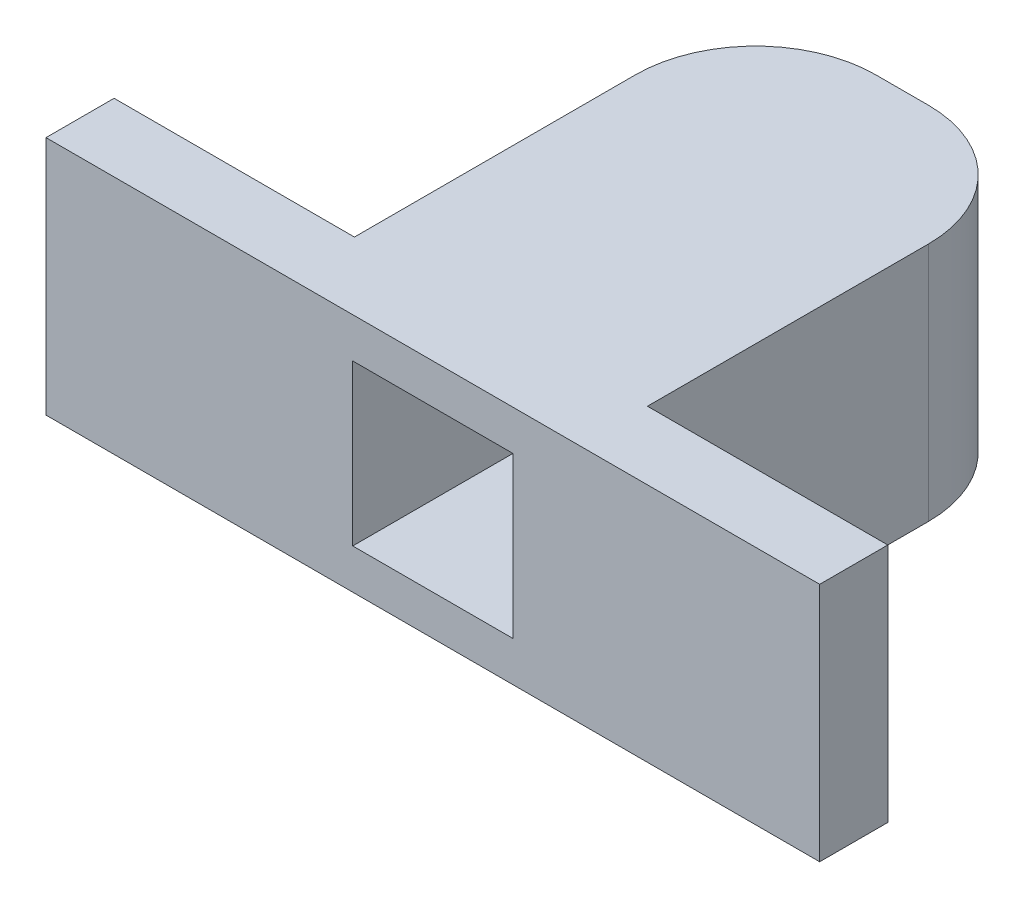
ISO-10303-21;
HEADER;
FILE_DESCRIPTION(('STEP AP214'),'2;1');
FILE_NAME('part.step','',(''),(''),'','','');
FILE_SCHEMA(('AUTOMOTIVE_DESIGN { 1 0 10303 214 1 1 1 1 }'));
ENDSEC;
DATA;
#1=APPLICATION_CONTEXT('core data for automotive mechanical design processes');
#2=APPLICATION_PROTOCOL_DEFINITION('international standard','automotive_design',2000,#1);
#3=PRODUCT_CONTEXT('',#1,'mechanical');
#4=PRODUCT('Part','Part','',(#3));
#5=PRODUCT_RELATED_PRODUCT_CATEGORY('part','',(#4));
#6=PRODUCT_DEFINITION_FORMATION('','',#4);
#7=PRODUCT_DEFINITION_CONTEXT('part definition',#1,'design');
#8=PRODUCT_DEFINITION('design','',#6,#7);
#9=PRODUCT_DEFINITION_SHAPE('','',#8);
#10=(LENGTH_UNIT() NAMED_UNIT(*) SI_UNIT(.MILLI.,.METRE.));
#11=(NAMED_UNIT(*) PLANE_ANGLE_UNIT() SI_UNIT($,.RADIAN.));
#12=(NAMED_UNIT(*) SI_UNIT($,.STERADIAN.) SOLID_ANGLE_UNIT());
#13=UNCERTAINTY_MEASURE_WITH_UNIT(LENGTH_MEASURE(1.E-05),#10,'distance_accuracy_value','');
#14=(GEOMETRIC_REPRESENTATION_CONTEXT(3) GLOBAL_UNCERTAINTY_ASSIGNED_CONTEXT((#13)) GLOBAL_UNIT_ASSIGNED_CONTEXT((#10,
#11,#12)) REPRESENTATION_CONTEXT('',''));
#15=CARTESIAN_POINT('',(0.,0.,0.));
#16=DIRECTION('',(0.,0.,1.));
#17=DIRECTION('',(1.,0.,0.));
#18=AXIS2_PLACEMENT_3D('',#15,#16,#17);
#19=CARTESIAN_POINT('',(13.8800748086397,3.,0.));
#20=DIRECTION('',(0.,0.,-1.));
#21=DIRECTION('',(-1.,0.,0.));
#22=AXIS2_PLACEMENT_3D('',#19,#20,#21);
#23=PLANE('',#22);
#24=DIRECTION('',(-1.,0.,0.));
#25=VECTOR('',#24,1.);
#26=CARTESIAN_POINT('',(8.05109057491405,2.5,0.));
#27=LINE('',#26,#25);
#28=CARTESIAN_POINT('',(10.051090574914,2.5,0.));
#29=VERTEX_POINT('',#28);
#30=CARTESIAN_POINT('',(8.05109057491405,2.5,0.));
#31=VERTEX_POINT('',#30);
#32=EDGE_CURVE('E241',#29,#31,#27,.T.);
#33=ORIENTED_EDGE('',*,*,#32,.F.);
#34=DIRECTION('',(0.,1.,0.));
#35=VECTOR('',#34,1.);
#36=CARTESIAN_POINT('',(10.051090574914,2.5,0.));
#37=LINE('',#36,#35);
#38=CARTESIAN_POINT('',(10.051090574914,0.5,0.));
#39=VERTEX_POINT('',#38);
#40=EDGE_CURVE('E51',#39,#29,#37,.T.);
#41=ORIENTED_EDGE('',*,*,#40,.F.);
#42=DIRECTION('',(1.,0.,0.));
#43=VECTOR('',#42,1.);
#44=CARTESIAN_POINT('',(8.05109057491405,0.5,0.));
#45=LINE('',#44,#43);
#46=CARTESIAN_POINT('',(8.05109057491405,0.5,0.));
#47=VERTEX_POINT('',#46);
#48=EDGE_CURVE('E234',#47,#39,#45,.T.);
#49=ORIENTED_EDGE('',*,*,#48,.F.);
#50=DIRECTION('',(0.,-1.,0.));
#51=VECTOR('',#50,1.);
#52=CARTESIAN_POINT('',(8.05109057491405,2.5,0.));
#53=LINE('',#52,#51);
#54=EDGE_CURVE('E238',#31,#47,#53,.T.);
#55=ORIENTED_EDGE('',*,*,#54,.F.);
#56=EDGE_LOOP('',(#33,#41,#49,#55));
#57=FACE_BOUND('',#56,.T.);
#58=DIRECTION('',(1.,0.,0.));
#59=VECTOR('',#58,1.);
#60=CARTESIAN_POINT('',(13.8800748086397,0.,0.));
#61=LINE('',#60,#59);
#62=CARTESIAN_POINT('',(4.22210634118835,0.,0.));
#63=VERTEX_POINT('',#62);
#64=CARTESIAN_POINT('',(13.8800748086397,0.,0.));
#65=VERTEX_POINT('',#64);
#66=EDGE_CURVE('E157',#63,#65,#61,.T.);
#67=ORIENTED_EDGE('',*,*,#66,.T.);
#68=DIRECTION('',(0.,-1.,0.));
#69=VECTOR('',#68,1.);
#70=CARTESIAN_POINT('',(13.8800748086397,3.,0.));
#71=LINE('',#70,#69);
#72=CARTESIAN_POINT('',(13.8800748086397,3.,0.));
#73=VERTEX_POINT('',#72);
#74=EDGE_CURVE('E11',#73,#65,#71,.T.);
#75=ORIENTED_EDGE('',*,*,#74,.F.);
#76=DIRECTION('',(1.,0.,0.));
#77=VECTOR('',#76,1.);
#78=CARTESIAN_POINT('',(13.8800748086397,3.,0.));
#79=LINE('',#78,#77);
#80=CARTESIAN_POINT('',(4.22210634118835,3.,0.));
#81=VERTEX_POINT('',#80);
#82=EDGE_CURVE('E177',#81,#73,#79,.T.);
#83=ORIENTED_EDGE('',*,*,#82,.F.);
#84=DIRECTION('',(0.,-1.,0.));
#85=VECTOR('',#84,1.);
#86=CARTESIAN_POINT('',(4.22210634118835,3.,0.));
#87=LINE('',#86,#85);
#88=EDGE_CURVE('E153',#81,#63,#87,.T.);
#89=ORIENTED_EDGE('',*,*,#88,.T.);
#90=EDGE_LOOP('',(#67,#75,#83,#89));
#91=FACE_BOUND('',#90,.T.);
#92=ADVANCED_FACE('F37',(#57,#91),#23,.F.);
#93=CARTESIAN_POINT('',(13.8800748086397,3.,-0.850000000000001));
#94=DIRECTION('',(-1.,0.,0.));
#95=DIRECTION('',(0.,0.,1.));
#96=AXIS2_PLACEMENT_3D('',#93,#94,#95);
#97=PLANE('',#96);
#98=DIRECTION('',(0.,0.,-1.));
#99=VECTOR('',#98,1.);
#100=CARTESIAN_POINT('',(13.8800748086397,0.,-0.850000000000001));
#101=LINE('',#100,#99);
#102=CARTESIAN_POINT('',(13.8800748086397,0.,-0.850000000000001));
#103=VERTEX_POINT('',#102);
#104=EDGE_CURVE('E160',#65,#103,#101,.T.);
#105=ORIENTED_EDGE('',*,*,#104,.T.);
#106=DIRECTION('',(0.,-1.,0.));
#107=VECTOR('',#106,1.);
#108=CARTESIAN_POINT('',(13.8800748086397,3.,-0.850000000000001));
#109=LINE('',#108,#107);
#110=CARTESIAN_POINT('',(13.8800748086397,3.,-0.850000000000001));
#111=VERTEX_POINT('',#110);
#112=EDGE_CURVE('E44',#111,#103,#109,.T.);
#113=ORIENTED_EDGE('',*,*,#112,.F.);
#114=DIRECTION('',(0.,0.,-1.));
#115=VECTOR('',#114,1.);
#116=CARTESIAN_POINT('',(13.8800748086397,3.,-0.850000000000001));
#117=LINE('',#116,#115);
#118=EDGE_CURVE('E107',#73,#111,#117,.T.);
#119=ORIENTED_EDGE('',*,*,#118,.F.);
#120=ORIENTED_EDGE('',*,*,#74,.T.);
#121=EDGE_LOOP('',(#105,#113,#119,#120));
#122=FACE_BOUND('',#121,.T.);
#123=ADVANCED_FACE('F295',(#122),#97,.F.);
#124=CARTESIAN_POINT('',(10.8800748086397,3.,-0.85));
#125=DIRECTION('',(0.,0.,1.));
#126=DIRECTION('',(1.,0.,0.));
#127=AXIS2_PLACEMENT_3D('',#124,#125,#126);
#128=PLANE('',#127);
#129=DIRECTION('',(-1.,0.,0.));
#130=VECTOR('',#129,1.);
#131=CARTESIAN_POINT('',(10.8800748086397,0.,-0.85));
#132=LINE('',#131,#130);
#133=CARTESIAN_POINT('',(10.8800748086397,0.,-0.85));
#134=VERTEX_POINT('',#133);
#135=EDGE_CURVE('E163',#103,#134,#132,.T.);
#136=ORIENTED_EDGE('',*,*,#135,.T.);
#137=DIRECTION('',(0.,-1.,0.));
#138=VECTOR('',#137,1.);
#139=CARTESIAN_POINT('',(10.8800748086397,3.,-0.85));
#140=LINE('',#139,#138);
#141=CARTESIAN_POINT('',(10.8800748086397,3.,-0.85));
#142=VERTEX_POINT('',#141);
#143=EDGE_CURVE('E190',#142,#134,#140,.T.);
#144=ORIENTED_EDGE('',*,*,#143,.F.);
#145=DIRECTION('',(-1.,0.,0.));
#146=VECTOR('',#145,1.);
#147=CARTESIAN_POINT('',(10.8800748086397,3.,-0.85));
#148=LINE('',#147,#146);
#149=EDGE_CURVE('E198',#111,#142,#148,.T.);
#150=ORIENTED_EDGE('',*,*,#149,.F.);
#151=ORIENTED_EDGE('',*,*,#112,.T.);
#152=EDGE_LOOP('',(#136,#144,#150,#151));
#153=FACE_BOUND('',#152,.T.);
#154=ADVANCED_FACE('F196',(#153),#128,.F.);
#155=CARTESIAN_POINT('',(10.8800748086397,3.,-4.35773515646011));
#156=DIRECTION('',(-1.,0.,0.));
#157=DIRECTION('',(0.,0.,1.));
#158=AXIS2_PLACEMENT_3D('',#155,#156,#157);
#159=PLANE('',#158);
#160=DIRECTION('',(0.,0.,-1.));
#161=VECTOR('',#160,1.);
#162=CARTESIAN_POINT('',(10.8800748086397,0.,-4.35773515646011));
#163=LINE('',#162,#161);
#164=CARTESIAN_POINT('',(10.8800748086397,0.,-4.35773515646011));
#165=VERTEX_POINT('',#164);
#166=EDGE_CURVE('E165',#134,#165,#163,.T.);
#167=ORIENTED_EDGE('',*,*,#166,.T.);
#168=DIRECTION('',(0.,-1.,0.));
#169=VECTOR('',#168,1.);
#170=CARTESIAN_POINT('',(10.8800748086397,3.,-4.35773515646011));
#171=LINE('',#170,#169);
#172=CARTESIAN_POINT('',(10.8800748086397,3.,-4.35773515646011));
#173=VERTEX_POINT('',#172);
#174=EDGE_CURVE('E187',#173,#165,#171,.T.);
#175=ORIENTED_EDGE('',*,*,#174,.F.);
#176=DIRECTION('',(0.,0.,-1.));
#177=VECTOR('',#176,1.);
#178=CARTESIAN_POINT('',(10.8800748086397,3.,-4.35773515646011));
#179=LINE('',#178,#177);
#180=EDGE_CURVE('E216',#142,#173,#179,.T.);
#181=ORIENTED_EDGE('',*,*,#180,.F.);
#182=ORIENTED_EDGE('',*,*,#143,.T.);
#183=EDGE_LOOP('',(#167,#175,#181,#182));
#184=FACE_BOUND('',#183,.T.);
#185=ADVANCED_FACE('F207',(#184),#159,.F.);
#186=CARTESIAN_POINT('',(9.38007480863974,3.,-4.35773515646012));
#187=DIRECTION('',(0.,-1.,0.));
#188=DIRECTION('',(0.,0.,-1.));
#189=AXIS2_PLACEMENT_3D('',#186,#187,#188);
#190=CYLINDRICAL_SURFACE('',#189,1.5);
#191=CARTESIAN_POINT('',(9.38007480863974,0.,-4.35773515646012));
#192=DIRECTION('',(0.,1.,0.));
#193=DIRECTION('',(0.,0.,-1.));
#194=AXIS2_PLACEMENT_3D('',#191,#192,#193);
#195=CIRCLE('',#194,1.5);
#196=CARTESIAN_POINT('',(9.38007480863973,0.,-5.85773515646012));
#197=VERTEX_POINT('',#196);
#198=EDGE_CURVE('E167',#165,#197,#195,.T.);
#199=ORIENTED_EDGE('',*,*,#198,.T.);
#200=DIRECTION('',(0.,-1.,0.));
#201=VECTOR('',#200,1.);
#202=CARTESIAN_POINT('',(9.38007480863973,3.,-5.85773515646012));
#203=LINE('',#202,#201);
#204=CARTESIAN_POINT('',(9.38007480863973,3.,-5.85773515646012));
#205=VERTEX_POINT('',#204);
#206=EDGE_CURVE('E184',#205,#197,#203,.T.);
#207=ORIENTED_EDGE('',*,*,#206,.F.);
#208=CARTESIAN_POINT('',(9.38007480863974,3.,-4.35773515646012));
#209=DIRECTION('',(0.,1.,0.));
#210=DIRECTION('',(0.,0.,-1.));
#211=AXIS2_PLACEMENT_3D('',#208,#209,#210);
#212=CIRCLE('',#211,1.5);
#213=EDGE_CURVE('E213',#173,#205,#212,.T.);
#214=ORIENTED_EDGE('',*,*,#213,.F.);
#215=ORIENTED_EDGE('',*,*,#174,.T.);
#216=EDGE_LOOP('',(#199,#207,#214,#215));
#217=FACE_BOUND('',#216,.T.);
#218=ADVANCED_FACE('F211',(#217),#190,.T.);
#219=CARTESIAN_POINT('',(8.72210634118836,3.,-5.85773515646012));
#220=DIRECTION('',(0.,0.,1.));
#221=DIRECTION('',(1.,0.,0.));
#222=AXIS2_PLACEMENT_3D('',#219,#220,#221);
#223=PLANE('',#222);
#224=DIRECTION('',(-1.,0.,0.));
#225=VECTOR('',#224,1.);
#226=CARTESIAN_POINT('',(8.72210634118836,0.,-5.85773515646012));
#227=LINE('',#226,#225);
#228=CARTESIAN_POINT('',(8.72210634118835,0.,-5.85773515646012));
#229=VERTEX_POINT('',#228);
#230=EDGE_CURVE('E169',#197,#229,#227,.T.);
#231=ORIENTED_EDGE('',*,*,#230,.T.);
#232=DIRECTION('',(0.,-1.,0.));
#233=VECTOR('',#232,1.);
#234=CARTESIAN_POINT('',(8.72210634118835,3.,-5.85773515646012));
#235=LINE('',#234,#233);
#236=CARTESIAN_POINT('',(8.72210634118835,3.,-5.85773515646012));
#237=VERTEX_POINT('',#236);
#238=EDGE_CURVE('E181',#237,#229,#235,.T.);
#239=ORIENTED_EDGE('',*,*,#238,.F.);
#240=DIRECTION('',(-1.,0.,0.));
#241=VECTOR('',#240,1.);
#242=CARTESIAN_POINT('',(8.72210634118836,3.,-5.85773515646012));
#243=LINE('',#242,#241);
#244=EDGE_CURVE('E215',#205,#237,#243,.T.);
#245=ORIENTED_EDGE('',*,*,#244,.F.);
#246=ORIENTED_EDGE('',*,*,#206,.T.);
#247=EDGE_LOOP('',(#231,#239,#245,#246));
#248=FACE_BOUND('',#247,.T.);
#249=ADVANCED_FACE('F308',(#248),#223,.F.);
#250=CARTESIAN_POINT('',(8.72210634118835,3.,-4.35773515646012));
#251=DIRECTION('',(0.,-1.,0.));
#252=DIRECTION('',(0.,0.,-1.));
#253=AXIS2_PLACEMENT_3D('',#250,#251,#252);
#254=CYLINDRICAL_SURFACE('',#253,1.5);
#255=CARTESIAN_POINT('',(8.72210634118835,0.,-4.35773515646012));
#256=DIRECTION('',(0.,1.,0.));
#257=DIRECTION('',(0.,0.,-1.));
#258=AXIS2_PLACEMENT_3D('',#255,#256,#257);
#259=CIRCLE('',#258,1.5);
#260=CARTESIAN_POINT('',(7.22210634118835,0.,-4.35773515646011));
#261=VERTEX_POINT('',#260);
#262=EDGE_CURVE('E171',#229,#261,#259,.T.);
#263=ORIENTED_EDGE('',*,*,#262,.T.);
#264=DIRECTION('',(0.,-1.,0.));
#265=VECTOR('',#264,1.);
#266=CARTESIAN_POINT('',(7.22210634118835,3.,-4.35773515646011));
#267=LINE('',#266,#265);
#268=CARTESIAN_POINT('',(7.22210634118835,3.,-4.35773515646011));
#269=VERTEX_POINT('',#268);
#270=EDGE_CURVE('E148',#269,#261,#267,.T.);
#271=ORIENTED_EDGE('',*,*,#270,.F.);
#272=CARTESIAN_POINT('',(8.72210634118835,3.,-4.35773515646012));
#273=DIRECTION('',(0.,1.,0.));
#274=DIRECTION('',(0.,0.,-1.));
#275=AXIS2_PLACEMENT_3D('',#272,#273,#274);
#276=CIRCLE('',#275,1.5);
#277=EDGE_CURVE('E136',#237,#269,#276,.T.);
#278=ORIENTED_EDGE('',*,*,#277,.F.);
#279=ORIENTED_EDGE('',*,*,#238,.T.);
#280=EDGE_LOOP('',(#263,#271,#278,#279));
#281=FACE_BOUND('',#280,.T.);
#282=ADVANCED_FACE('F311',(#281),#254,.T.);
#283=CARTESIAN_POINT('',(7.22210634118835,3.,-0.85));
#284=DIRECTION('',(1.,0.,0.));
#285=DIRECTION('',(0.,0.,-1.));
#286=AXIS2_PLACEMENT_3D('',#283,#284,#285);
#287=PLANE('',#286);
#288=DIRECTION('',(0.,0.,1.));
#289=VECTOR('',#288,1.);
#290=CARTESIAN_POINT('',(7.22210634118835,0.,-0.85));
#291=LINE('',#290,#289);
#292=CARTESIAN_POINT('',(7.22210634118835,0.,-0.85));
#293=VERTEX_POINT('',#292);
#294=EDGE_CURVE('E145',#261,#293,#291,.T.);
#295=ORIENTED_EDGE('',*,*,#294,.T.);
#296=DIRECTION('',(0.,-1.,0.));
#297=VECTOR('',#296,1.);
#298=CARTESIAN_POINT('',(7.22210634118835,3.,-0.85));
#299=LINE('',#298,#297);
#300=CARTESIAN_POINT('',(7.22210634118835,3.,-0.85));
#301=VERTEX_POINT('',#300);
#302=EDGE_CURVE('E142',#301,#293,#299,.T.);
#303=ORIENTED_EDGE('',*,*,#302,.F.);
#304=DIRECTION('',(0.,0.,1.));
#305=VECTOR('',#304,1.);
#306=CARTESIAN_POINT('',(7.22210634118835,3.,-0.85));
#307=LINE('',#306,#305);
#308=EDGE_CURVE('E129',#269,#301,#307,.T.);
#309=ORIENTED_EDGE('',*,*,#308,.F.);
#310=ORIENTED_EDGE('',*,*,#270,.T.);
#311=EDGE_LOOP('',(#295,#303,#309,#310));
#312=FACE_BOUND('',#311,.T.);
#313=ADVANCED_FACE('F143',(#312),#287,.F.);
#314=CARTESIAN_POINT('',(4.22210634118835,3.,-0.85));
#315=DIRECTION('',(0.,0.,1.));
#316=DIRECTION('',(1.,0.,0.));
#317=AXIS2_PLACEMENT_3D('',#314,#315,#316);
#318=PLANE('',#317);
#319=DIRECTION('',(-1.,0.,0.));
#320=VECTOR('',#319,1.);
#321=CARTESIAN_POINT('',(4.22210634118835,0.,-0.85));
#322=LINE('',#321,#320);
#323=CARTESIAN_POINT('',(4.22210634118835,0.,-0.85));
#324=VERTEX_POINT('',#323);
#325=EDGE_CURVE('E174',#293,#324,#322,.T.);
#326=ORIENTED_EDGE('',*,*,#325,.T.);
#327=DIRECTION('',(0.,-1.,0.));
#328=VECTOR('',#327,1.);
#329=CARTESIAN_POINT('',(4.22210634118835,3.,-0.85));
#330=LINE('',#329,#328);
#331=CARTESIAN_POINT('',(4.22210634118835,3.,-0.85));
#332=VERTEX_POINT('',#331);
#333=EDGE_CURVE('E149',#332,#324,#330,.T.);
#334=ORIENTED_EDGE('',*,*,#333,.F.);
#335=DIRECTION('',(-1.,0.,0.));
#336=VECTOR('',#335,1.);
#337=CARTESIAN_POINT('',(4.22210634118835,3.,-0.85));
#338=LINE('',#337,#336);
#339=EDGE_CURVE('E133',#301,#332,#338,.T.);
#340=ORIENTED_EDGE('',*,*,#339,.F.);
#341=ORIENTED_EDGE('',*,*,#302,.T.);
#342=EDGE_LOOP('',(#326,#334,#340,#341));
#343=FACE_BOUND('',#342,.T.);
#344=ADVANCED_FACE('F151',(#343),#318,.F.);
#345=CARTESIAN_POINT('',(4.22210634118835,3.,0.));
#346=DIRECTION('',(1.,0.,0.));
#347=DIRECTION('',(0.,0.,-1.));
#348=AXIS2_PLACEMENT_3D('',#345,#346,#347);
#349=PLANE('',#348);
#350=DIRECTION('',(0.,0.,1.));
#351=VECTOR('',#350,1.);
#352=CARTESIAN_POINT('',(4.22210634118835,0.,0.));
#353=LINE('',#352,#351);
#354=EDGE_CURVE('E99',#324,#63,#353,.T.);
#355=ORIENTED_EDGE('',*,*,#354,.T.);
#356=ORIENTED_EDGE('',*,*,#88,.F.);
#357=DIRECTION('',(0.,0.,1.));
#358=VECTOR('',#357,1.);
#359=CARTESIAN_POINT('',(4.22210634118835,3.,0.));
#360=LINE('',#359,#358);
#361=EDGE_CURVE('E60',#332,#81,#360,.T.);
#362=ORIENTED_EDGE('',*,*,#361,.F.);
#363=ORIENTED_EDGE('',*,*,#333,.T.);
#364=EDGE_LOOP('',(#355,#356,#362,#363));
#365=FACE_BOUND('',#364,.T.);
#366=ADVANCED_FACE('F320',(#365),#349,.F.);
#367=CARTESIAN_POINT('',(8.72210634118835,3.,-4.35773515646012));
#368=DIRECTION('',(0.,-1.,0.));
#369=DIRECTION('',(0.,0.,-1.));
#370=AXIS2_PLACEMENT_3D('',#367,#368,#369);
#371=PLANE('',#370);
#372=ORIENTED_EDGE('',*,*,#82,.T.);
#373=ORIENTED_EDGE('',*,*,#118,.T.);
#374=ORIENTED_EDGE('',*,*,#149,.T.);
#375=ORIENTED_EDGE('',*,*,#180,.T.);
#376=ORIENTED_EDGE('',*,*,#213,.T.);
#377=ORIENTED_EDGE('',*,*,#244,.T.);
#378=ORIENTED_EDGE('',*,*,#277,.T.);
#379=ORIENTED_EDGE('',*,*,#308,.T.);
#380=ORIENTED_EDGE('',*,*,#339,.T.);
#381=ORIENTED_EDGE('',*,*,#361,.T.);
#382=EDGE_LOOP('',(#372,#373,#374,#375,#376,#377,#378,#379,#380,#381));
#383=FACE_BOUND('',#382,.T.);
#384=ADVANCED_FACE('F131',(#383),#371,.F.);
#385=CARTESIAN_POINT('',(8.72210634118835,0.,-4.35773515646012));
#386=DIRECTION('',(0.,-1.,0.));
#387=DIRECTION('',(0.,0.,-1.));
#388=AXIS2_PLACEMENT_3D('',#385,#386,#387);
#389=PLANE('',#388);
#390=ORIENTED_EDGE('',*,*,#66,.F.);
#391=ORIENTED_EDGE('',*,*,#354,.F.);
#392=ORIENTED_EDGE('',*,*,#325,.F.);
#393=ORIENTED_EDGE('',*,*,#294,.F.);
#394=ORIENTED_EDGE('',*,*,#262,.F.);
#395=ORIENTED_EDGE('',*,*,#230,.F.);
#396=ORIENTED_EDGE('',*,*,#198,.F.);
#397=ORIENTED_EDGE('',*,*,#166,.F.);
#398=ORIENTED_EDGE('',*,*,#135,.F.);
#399=ORIENTED_EDGE('',*,*,#104,.F.);
#400=EDGE_LOOP('',(#390,#391,#392,#393,#394,#395,#396,#397,#398,#399));
#401=FACE_BOUND('',#400,.T.);
#402=ADVANCED_FACE('F202',(#401),#389,.T.);
#403=CARTESIAN_POINT('',(10.051090574914,2.5,-5.));
#404=DIRECTION('',(1.,0.,0.));
#405=DIRECTION('',(0.,0.,-1.));
#406=AXIS2_PLACEMENT_3D('',#403,#404,#405);
#407=PLANE('',#406);
#408=ORIENTED_EDGE('',*,*,#40,.T.);
#409=DIRECTION('',(0.,0.,1.));
#410=VECTOR('',#409,1.);
#411=CARTESIAN_POINT('',(10.051090574914,2.5,-5.));
#412=LINE('',#411,#410);
#413=CARTESIAN_POINT('',(10.051090574914,2.5,-5.));
#414=VERTEX_POINT('',#413);
#415=EDGE_CURVE('E224',#414,#29,#412,.T.);
#416=ORIENTED_EDGE('',*,*,#415,.F.);
#417=DIRECTION('',(0.,1.,0.));
#418=VECTOR('',#417,1.);
#419=CARTESIAN_POINT('',(10.051090574914,2.5,-5.));
#420=LINE('',#419,#418);
#421=CARTESIAN_POINT('',(10.051090574914,0.5,-5.));
#422=VERTEX_POINT('',#421);
#423=EDGE_CURVE('E237',#422,#414,#420,.T.);
#424=ORIENTED_EDGE('',*,*,#423,.F.);
#425=DIRECTION('',(0.,0.,1.));
#426=VECTOR('',#425,1.);
#427=CARTESIAN_POINT('',(10.051090574914,0.5,-5.));
#428=LINE('',#427,#426);
#429=EDGE_CURVE('E161',#422,#39,#428,.T.);
#430=ORIENTED_EDGE('',*,*,#429,.T.);
#431=EDGE_LOOP('',(#408,#416,#424,#430));
#432=FACE_BOUND('',#431,.T.);
#433=ADVANCED_FACE('F262',(#432),#407,.F.);
#434=CARTESIAN_POINT('',(8.05109057491405,0.5,-5.));
#435=DIRECTION('',(0.,-1.,0.));
#436=DIRECTION('',(1.,0.,0.));
#437=AXIS2_PLACEMENT_3D('',#434,#435,#436);
#438=PLANE('',#437);
#439=ORIENTED_EDGE('',*,*,#48,.T.);
#440=ORIENTED_EDGE('',*,*,#429,.F.);
#441=DIRECTION('',(1.,0.,0.));
#442=VECTOR('',#441,1.);
#443=CARTESIAN_POINT('',(8.05109057491405,0.5,-5.));
#444=LINE('',#443,#442);
#445=CARTESIAN_POINT('',(8.05109057491405,0.5,-5.));
#446=VERTEX_POINT('',#445);
#447=EDGE_CURVE('E227',#446,#422,#444,.T.);
#448=ORIENTED_EDGE('',*,*,#447,.F.);
#449=DIRECTION('',(0.,0.,1.));
#450=VECTOR('',#449,1.);
#451=CARTESIAN_POINT('',(8.05109057491405,0.5,-5.));
#452=LINE('',#451,#450);
#453=EDGE_CURVE('E230',#446,#47,#452,.T.);
#454=ORIENTED_EDGE('',*,*,#453,.T.);
#455=EDGE_LOOP('',(#439,#440,#448,#454));
#456=FACE_BOUND('',#455,.T.);
#457=ADVANCED_FACE('F273',(#456),#438,.F.);
#458=CARTESIAN_POINT('',(8.05109057491405,2.5,-5.));
#459=DIRECTION('',(-1.,0.,0.));
#460=DIRECTION('',(0.,0.,1.));
#461=AXIS2_PLACEMENT_3D('',#458,#459,#460);
#462=PLANE('',#461);
#463=ORIENTED_EDGE('',*,*,#54,.T.);
#464=ORIENTED_EDGE('',*,*,#453,.F.);
#465=DIRECTION('',(0.,-1.,0.));
#466=VECTOR('',#465,1.);
#467=CARTESIAN_POINT('',(8.05109057491405,2.5,-5.));
#468=LINE('',#467,#466);
#469=CARTESIAN_POINT('',(8.05109057491405,2.5,-5.));
#470=VERTEX_POINT('',#469);
#471=EDGE_CURVE('E247',#470,#446,#468,.T.);
#472=ORIENTED_EDGE('',*,*,#471,.F.);
#473=DIRECTION('',(0.,0.,1.));
#474=VECTOR('',#473,1.);
#475=CARTESIAN_POINT('',(8.05109057491405,2.5,-5.));
#476=LINE('',#475,#474);
#477=EDGE_CURVE('E226',#470,#31,#476,.T.);
#478=ORIENTED_EDGE('',*,*,#477,.T.);
#479=EDGE_LOOP('',(#463,#464,#472,#478));
#480=FACE_BOUND('',#479,.T.);
#481=ADVANCED_FACE('F278',(#480),#462,.F.);
#482=CARTESIAN_POINT('',(8.05109057491405,2.5,-5.));
#483=DIRECTION('',(0.,1.,0.));
#484=DIRECTION('',(0.,0.,1.));
#485=AXIS2_PLACEMENT_3D('',#482,#483,#484);
#486=PLANE('',#485);
#487=ORIENTED_EDGE('',*,*,#32,.T.);
#488=ORIENTED_EDGE('',*,*,#477,.F.);
#489=DIRECTION('',(-1.,0.,0.));
#490=VECTOR('',#489,1.);
#491=CARTESIAN_POINT('',(8.05109057491405,2.5,-5.));
#492=LINE('',#491,#490);
#493=EDGE_CURVE('E250',#414,#470,#492,.T.);
#494=ORIENTED_EDGE('',*,*,#493,.F.);
#495=ORIENTED_EDGE('',*,*,#415,.T.);
#496=EDGE_LOOP('',(#487,#488,#494,#495));
#497=FACE_BOUND('',#496,.T.);
#498=ADVANCED_FACE('F284',(#497),#486,.F.);
#499=CARTESIAN_POINT('',(0.,0.,-5.));
#500=DIRECTION('',(0.,0.,1.));
#501=DIRECTION('',(1.,0.,0.));
#502=AXIS2_PLACEMENT_3D('',#499,#500,#501);
#503=PLANE('',#502);
#504=ORIENTED_EDGE('',*,*,#423,.T.);
#505=ORIENTED_EDGE('',*,*,#493,.T.);
#506=ORIENTED_EDGE('',*,*,#471,.T.);
#507=ORIENTED_EDGE('',*,*,#447,.T.);
#508=EDGE_LOOP('',(#504,#505,#506,#507));
#509=FACE_BOUND('',#508,.T.);
#510=ADVANCED_FACE('F257',(#509),#503,.T.);
#511=CLOSED_SHELL('',(#92,#123,#154,#185,#218,#249,#282,#313,#344,#366,#384,#402,#433,#457,#481,
#498,#510));
#512=MANIFOLD_SOLID_BREP('B2',#511);
#513=ADVANCED_BREP_SHAPE_REPRESENTATION('',(#18,#512),#14);
#514=SHAPE_DEFINITION_REPRESENTATION(#9,#513);
ENDSEC;
END-ISO-10303-21;
